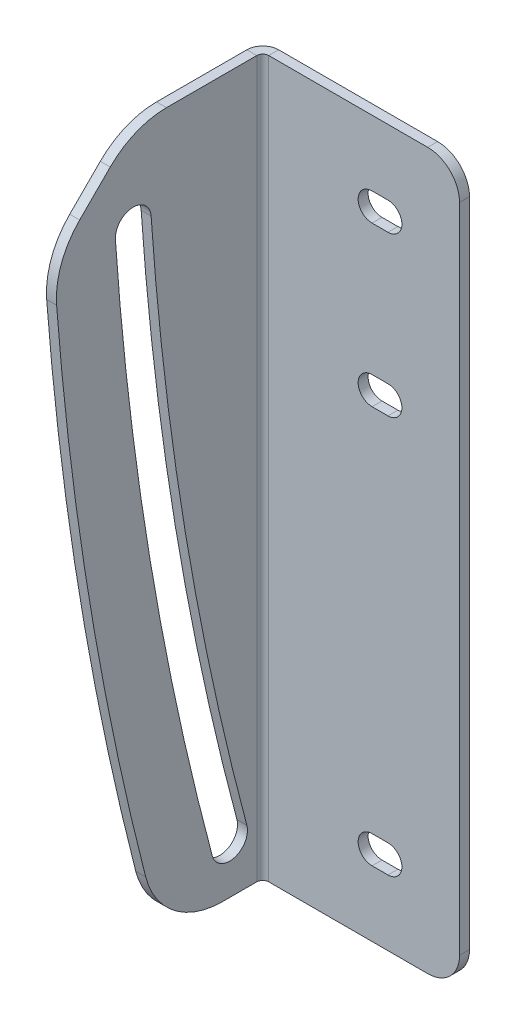
ISO-10303-21;
HEADER;
FILE_DESCRIPTION(('STEP AP214'),'2;1');
FILE_NAME('part.step','',(''),(''),'','','');
FILE_SCHEMA(('AUTOMOTIVE_DESIGN { 1 0 10303 214 1 1 1 1 }'));
ENDSEC;
DATA;
#1=APPLICATION_CONTEXT('core data for automotive mechanical design processes');
#2=APPLICATION_PROTOCOL_DEFINITION('international standard','automotive_design',2000,#1);
#3=PRODUCT_CONTEXT('',#1,'mechanical');
#4=PRODUCT('Part','Part','',(#3));
#5=PRODUCT_RELATED_PRODUCT_CATEGORY('part','',(#4));
#6=PRODUCT_DEFINITION_FORMATION('','',#4);
#7=PRODUCT_DEFINITION_CONTEXT('part definition',#1,'design');
#8=PRODUCT_DEFINITION('design','',#6,#7);
#9=PRODUCT_DEFINITION_SHAPE('','',#8);
#10=(LENGTH_UNIT() NAMED_UNIT(*) SI_UNIT(.MILLI.,.METRE.));
#11=(NAMED_UNIT(*) PLANE_ANGLE_UNIT() SI_UNIT($,.RADIAN.));
#12=(NAMED_UNIT(*) SI_UNIT($,.STERADIAN.) SOLID_ANGLE_UNIT());
#13=UNCERTAINTY_MEASURE_WITH_UNIT(LENGTH_MEASURE(1.E-05),#10,'distance_accuracy_value','');
#14=(GEOMETRIC_REPRESENTATION_CONTEXT(3) GLOBAL_UNCERTAINTY_ASSIGNED_CONTEXT((#13)) GLOBAL_UNIT_ASSIGNED_CONTEXT((#10,
#11,#12)) REPRESENTATION_CONTEXT('',''));
#15=CARTESIAN_POINT('',(0.,0.,0.));
#16=DIRECTION('',(0.,0.,1.));
#17=DIRECTION('',(1.,0.,0.));
#18=AXIS2_PLACEMENT_3D('',#15,#16,#17);
#19=CARTESIAN_POINT('',(-49.5,90.,0.));
#20=DIRECTION('',(-1.,0.,0.));
#21=DIRECTION('',(0.,0.,-1.));
#22=AXIS2_PLACEMENT_3D('',#19,#20,#21);
#23=PLANE('',#22);
#24=CARTESIAN_POINT('',(-49.4999999999999,121.,-733.));
#25=DIRECTION('',(1.,0.,0.));
#26=DIRECTION('',(0.,0.,1.));
#27=AXIS2_PLACEMENT_3D('',#24,#25,#26);
#28=CIRCLE('',#27,765.396096885807);
#29=CARTESIAN_POINT('',(-49.5,68.3097820614557,30.5803337315705));
#30=VERTEX_POINT('',#29);
#31=CARTESIAN_POINT('',(-49.5,-76.420146598865,6.49744478592396));
#32=VERTEX_POINT('',#31);
#33=EDGE_CURVE('E239',#30,#32,#28,.T.);
#34=ORIENTED_EDGE('',*,*,#33,.T.);
#35=CARTESIAN_POINT('',(-49.5,-77.5808406020218,10.8451786129925));
#36=DIRECTION('',(-1.,0.,0.));
#37=DIRECTION('',(0.,0.,1.));
#38=AXIS2_PLACEMENT_3D('',#35,#36,#37);
#39=CIRCLE('',#38,4.4999999999999);
#40=CARTESIAN_POINT('',(-49.5,-78.7415346051785,15.1929124400609));
#41=VERTEX_POINT('',#40);
#42=EDGE_CURVE('E268',#32,#41,#39,.T.);
#43=ORIENTED_EDGE('',*,*,#42,.T.);
#44=CARTESIAN_POINT('',(-49.4999999999999,121.,-733.));
#45=DIRECTION('',(-1.,0.,0.));
#46=DIRECTION('',(0.,0.,1.));
#47=AXIS2_PLACEMENT_3D('',#44,#45,#46);
#48=CIRCLE('',#47,774.396096885807);
#49=CARTESIAN_POINT('',(-49.5,67.6902179385442,39.5589828670251));
#50=VERTEX_POINT('',#49);
#51=EDGE_CURVE('E245',#41,#50,#48,.T.);
#52=ORIENTED_EDGE('',*,*,#51,.T.);
#53=CARTESIAN_POINT('',(-49.5,68.,35.0696582992976));
#54=DIRECTION('',(-1.,0.,0.));
#55=DIRECTION('',(0.,0.,-1.));
#56=AXIS2_PLACEMENT_3D('',#53,#54,#55);
#57=CIRCLE('',#56,4.49999999999997);
#58=EDGE_CURVE('E260',#50,#30,#57,.T.);
#59=ORIENTED_EDGE('',*,*,#58,.T.);
#60=EDGE_LOOP('',(#34,#43,#52,#59));
#61=FACE_BOUND('',#60,.T.);
#62=CARTESIAN_POINT('',(-49.4999999999999,121.,-733.));
#63=DIRECTION('',(-1.,0.,0.));
#64=DIRECTION('',(0.,0.,1.));
#65=AXIS2_PLACEMENT_3D('',#62,#63,#64);
#66=CIRCLE('',#65,789.648656049005);
#67=CARTESIAN_POINT('',(-49.5,-74.9633036710672,31.9466540970822));
#68=VERTEX_POINT('',#67);
#69=CARTESIAN_POINT('',(-49.5,60.7830348010761,54.3492980261251));
#70=VERTEX_POINT('',#69);
#71=EDGE_CURVE('E487',#68,#70,#66,.T.);
#72=ORIENTED_EDGE('',*,*,#71,.F.);
#73=CARTESIAN_POINT('',(-49.5,-70.,12.5722994841211));
#74=DIRECTION('',(1.,0.,0.));
#75=DIRECTION('',(0.,0.,-1.));
#76=AXIS2_PLACEMENT_3D('',#73,#74,#75);
#77=CIRCLE('',#76,20.);
#78=CARTESIAN_POINT('',(-49.5,-90.,12.5722994841211));
#79=VERTEX_POINT('',#78);
#80=EDGE_CURVE('E459',#79,#68,#77,.F.);
#81=ORIENTED_EDGE('',*,*,#80,.F.);
#82=DIRECTION('',(0.,0.,1.));
#83=VECTOR('',#82,1.);
#84=CARTESIAN_POINT('',(-49.5,-90.,0.));
#85=LINE('',#84,#83);
#86=CARTESIAN_POINT('',(-49.5,-90.,4.));
#87=VERTEX_POINT('',#86);
#88=EDGE_CURVE('E372',#87,#79,#85,.T.);
#89=ORIENTED_EDGE('',*,*,#88,.F.);
#90=DIRECTION('',(0.,-1.,0.));
#91=VECTOR('',#90,1.);
#92=CARTESIAN_POINT('',(-49.5,90.,4.));
#93=LINE('',#92,#91);
#94=CARTESIAN_POINT('',(-49.5,90.,4.));
#95=VERTEX_POINT('',#94);
#96=EDGE_CURVE('E388',#95,#87,#93,.T.);
#97=ORIENTED_EDGE('',*,*,#96,.F.);
#98=DIRECTION('',(0.,0.,1.));
#99=VECTOR('',#98,1.);
#100=CARTESIAN_POINT('',(-49.5,90.,0.));
#101=LINE('',#100,#99);
#102=CARTESIAN_POINT('',(-49.5,90.,26.7157287525381));
#103=VERTEX_POINT('',#102);
#104=EDGE_CURVE('E373',#95,#103,#101,.T.);
#105=ORIENTED_EDGE('',*,*,#104,.T.);
#106=CARTESIAN_POINT('',(-49.5,70.,26.7157287525381));
#107=DIRECTION('',(1.,0.,0.));
#108=DIRECTION('',(0.,0.,-1.));
#109=AXIS2_PLACEMENT_3D('',#106,#107,#108);
#110=CIRCLE('',#109,20.);
#111=CARTESIAN_POINT('',(-49.5,84.1421356237309,40.8578643762691));
#112=VERTEX_POINT('',#111);
#113=EDGE_CURVE('E462',#112,#103,#110,.F.);
#114=ORIENTED_EDGE('',*,*,#113,.F.);
#115=DIRECTION('',(0.,-0.707106781186548,0.707106781186547));
#116=VECTOR('',#115,1.);
#117=CARTESIAN_POINT('',(-49.5,70.,55.));
#118=LINE('',#117,#116);
#119=CARTESIAN_POINT('',(-49.5,76.4503288541322,48.5496711458678));
#120=VERTEX_POINT('',#119);
#121=EDGE_CURVE('E429',#120,#112,#118,.F.);
#122=ORIENTED_EDGE('',*,*,#121,.F.);
#123=CARTESIAN_POINT('',(-49.5,62.3081932304013,34.4075355221369));
#124=DIRECTION('',(1.,0.,0.));
#125=DIRECTION('',(0.,0.,-1.));
#126=AXIS2_PLACEMENT_3D('',#123,#124,#125);
#127=CIRCLE('',#126,20.);
#128=EDGE_CURVE('E464',#70,#120,#127,.F.);
#129=ORIENTED_EDGE('',*,*,#128,.F.);
#130=EDGE_LOOP('',(#72,#81,#89,#97,#105,#114,#122,#129));
#131=FACE_BOUND('',#130,.T.);
#132=ADVANCED_FACE('F37',(#61,#131),#23,.F.);
#133=CARTESIAN_POINT('',(-52.,90.,0.));
#134=DIRECTION('',(-1.,0.,0.));
#135=DIRECTION('',(0.,0.,-1.));
#136=AXIS2_PLACEMENT_3D('',#133,#134,#135);
#137=PLANE('',#136);
#138=CARTESIAN_POINT('',(-52.,68.,35.0696582992976));
#139=DIRECTION('',(1.,0.,0.));
#140=DIRECTION('',(0.,0.,-1.));
#141=AXIS2_PLACEMENT_3D('',#138,#139,#140);
#142=CIRCLE('',#141,4.49999999999997);
#143=CARTESIAN_POINT('',(-52.,67.6902179385442,39.558982867025));
#144=VERTEX_POINT('',#143);
#145=CARTESIAN_POINT('',(-52.,68.3097820614557,30.5803337315705));
#146=VERTEX_POINT('',#145);
#147=EDGE_CURVE('E252',#144,#146,#142,.F.);
#148=ORIENTED_EDGE('',*,*,#147,.F.);
#149=CARTESIAN_POINT('',(-51.9999999999999,121.,-733.));
#150=DIRECTION('',(1.,0.,0.));
#151=DIRECTION('',(0.,0.,-1.));
#152=AXIS2_PLACEMENT_3D('',#149,#150,#151);
#153=CIRCLE('',#152,774.396096885807);
#154=CARTESIAN_POINT('',(-52.,-78.7415346051785,15.1929124400609));
#155=VERTEX_POINT('',#154);
#156=EDGE_CURVE('E261',#155,#144,#153,.F.);
#157=ORIENTED_EDGE('',*,*,#156,.F.);
#158=CARTESIAN_POINT('',(-52.,-77.5808406020218,10.8451786129925));
#159=DIRECTION('',(1.,0.,0.));
#160=DIRECTION('',(0.,0.,-1.));
#161=AXIS2_PLACEMENT_3D('',#158,#159,#160);
#162=CIRCLE('',#161,4.4999999999999);
#163=CARTESIAN_POINT('',(-52.,-76.420146598865,6.49744478592396));
#164=VERTEX_POINT('',#163);
#165=EDGE_CURVE('E254',#164,#155,#162,.F.);
#166=ORIENTED_EDGE('',*,*,#165,.F.);
#167=CARTESIAN_POINT('',(-51.9999999999999,121.,-733.));
#168=DIRECTION('',(1.,0.,0.));
#169=DIRECTION('',(0.,0.,-1.));
#170=AXIS2_PLACEMENT_3D('',#167,#168,#169);
#171=CIRCLE('',#170,765.396096885807);
#172=EDGE_CURVE('E236',#146,#164,#171,.T.);
#173=ORIENTED_EDGE('',*,*,#172,.F.);
#174=EDGE_LOOP('',(#148,#157,#166,#173));
#175=FACE_BOUND('',#174,.T.);
#176=DIRECTION('',(0.,0.707106781186548,-0.707106781186547));
#177=VECTOR('',#176,1.);
#178=CARTESIAN_POINT('',(-52.,107.5,17.5));
#179=LINE('',#178,#177);
#180=CARTESIAN_POINT('',(-52.,84.1421356237309,40.8578643762691));
#181=VERTEX_POINT('',#180);
#182=CARTESIAN_POINT('',(-52.,76.4503288541322,48.5496711458678));
#183=VERTEX_POINT('',#182);
#184=EDGE_CURVE('E432',#181,#183,#179,.F.);
#185=ORIENTED_EDGE('',*,*,#184,.F.);
#186=CARTESIAN_POINT('',(-52.,70.,26.7157287525381));
#187=DIRECTION('',(1.,0.,0.));
#188=DIRECTION('',(0.,0.,-1.));
#189=AXIS2_PLACEMENT_3D('',#186,#187,#188);
#190=CIRCLE('',#189,20.);
#191=CARTESIAN_POINT('',(-52.,90.,26.7157287525381));
#192=VERTEX_POINT('',#191);
#193=EDGE_CURVE('E473',#192,#181,#190,.T.);
#194=ORIENTED_EDGE('',*,*,#193,.F.);
#195=DIRECTION('',(0.,0.,1.));
#196=VECTOR('',#195,1.);
#197=CARTESIAN_POINT('',(-52.,90.,0.));
#198=LINE('',#197,#196);
#199=CARTESIAN_POINT('',(-52.,90.,4.));
#200=VERTEX_POINT('',#199);
#201=EDGE_CURVE('E376',#200,#192,#198,.T.);
#202=ORIENTED_EDGE('',*,*,#201,.F.);
#203=DIRECTION('',(0.,-1.,0.));
#204=VECTOR('',#203,1.);
#205=CARTESIAN_POINT('',(-52.,90.,4.));
#206=LINE('',#205,#204);
#207=CARTESIAN_POINT('',(-52.,-90.,4.));
#208=VERTEX_POINT('',#207);
#209=EDGE_CURVE('E414',#200,#208,#206,.T.);
#210=ORIENTED_EDGE('',*,*,#209,.T.);
#211=DIRECTION('',(0.,0.,1.));
#212=VECTOR('',#211,1.);
#213=CARTESIAN_POINT('',(-52.,-90.,0.));
#214=LINE('',#213,#212);
#215=CARTESIAN_POINT('',(-52.,-90.,12.5722994841211));
#216=VERTEX_POINT('',#215);
#217=EDGE_CURVE('E390',#208,#216,#214,.T.);
#218=ORIENTED_EDGE('',*,*,#217,.T.);
#219=CARTESIAN_POINT('',(-52.,-70.,12.5722994841211));
#220=DIRECTION('',(1.,0.,0.));
#221=DIRECTION('',(0.,0.,-1.));
#222=AXIS2_PLACEMENT_3D('',#219,#220,#221);
#223=CIRCLE('',#222,20.);
#224=CARTESIAN_POINT('',(-52.,-74.9633036710672,31.9466540970822));
#225=VERTEX_POINT('',#224);
#226=EDGE_CURVE('E471',#225,#216,#223,.T.);
#227=ORIENTED_EDGE('',*,*,#226,.F.);
#228=CARTESIAN_POINT('',(-51.9999999999999,121.,-733.));
#229=DIRECTION('',(1.,0.,0.));
#230=DIRECTION('',(0.,0.,-1.));
#231=AXIS2_PLACEMENT_3D('',#228,#229,#230);
#232=CIRCLE('',#231,789.648656049005);
#233=CARTESIAN_POINT('',(-52.,60.7830348010761,54.3492980261251));
#234=VERTEX_POINT('',#233);
#235=EDGE_CURVE('E485',#234,#225,#232,.T.);
#236=ORIENTED_EDGE('',*,*,#235,.F.);
#237=CARTESIAN_POINT('',(-52.,62.3081932304013,34.4075355221369));
#238=DIRECTION('',(1.,0.,0.));
#239=DIRECTION('',(0.,0.,-1.));
#240=AXIS2_PLACEMENT_3D('',#237,#238,#239);
#241=CIRCLE('',#240,20.);
#242=EDGE_CURVE('E475',#183,#234,#241,.T.);
#243=ORIENTED_EDGE('',*,*,#242,.F.);
#244=EDGE_LOOP('',(#185,#194,#202,#210,#218,#227,#236,#243));
#245=FACE_BOUND('',#244,.T.);
#246=ADVANCED_FACE('F249',(#175,#245),#137,.T.);
#247=CARTESIAN_POINT('',(-48.,-90.,4.));
#248=DIRECTION('',(0.,1.,0.));
#249=DIRECTION('',(-1.,0.,0.));
#250=AXIS2_PLACEMENT_3D('',#247,#248,#249);
#251=PLANE('',#250);
#252=ORIENTED_EDGE('',*,*,#217,.F.);
#253=DIRECTION('',(-1.,0.,0.));
#254=VECTOR('',#253,1.);
#255=CARTESIAN_POINT('',(-49.5,-90.,4.));
#256=LINE('',#255,#254);
#257=EDGE_CURVE('E417',#87,#208,#256,.T.);
#258=ORIENTED_EDGE('',*,*,#257,.F.);
#259=ORIENTED_EDGE('',*,*,#88,.T.);
#260=DIRECTION('',(-1.,0.,0.));
#261=VECTOR('',#260,1.);
#262=CARTESIAN_POINT('',(-49.5,-90.,12.5722994841211));
#263=LINE('',#262,#261);
#264=EDGE_CURVE('E11',#216,#79,#263,.F.);
#265=ORIENTED_EDGE('',*,*,#264,.F.);
#266=EDGE_LOOP('',(#252,#258,#259,#265));
#267=FACE_BOUND('',#266,.T.);
#268=ADVANCED_FACE('F516',(#267),#251,.F.);
#269=CARTESIAN_POINT('',(-52.,90.,4.));
#270=DIRECTION('',(0.,1.,0.));
#271=DIRECTION('',(0.,0.,1.));
#272=AXIS2_PLACEMENT_3D('',#269,#270,#271);
#273=PLANE('',#272);
#274=DIRECTION('',(1.,0.,0.));
#275=VECTOR('',#274,1.);
#276=CARTESIAN_POINT('',(-52.,90.,4.));
#277=LINE('',#276,#275);
#278=EDGE_CURVE('E426',#200,#95,#277,.T.);
#279=ORIENTED_EDGE('',*,*,#278,.T.);
#280=CARTESIAN_POINT('',(-48.,90.,4.));
#281=DIRECTION('',(0.,-1.,0.));
#282=DIRECTION('',(-1.,0.,0.));
#283=AXIS2_PLACEMENT_3D('',#280,#281,#282);
#284=CIRCLE('',#283,1.5);
#285=CARTESIAN_POINT('',(-48.,90.,2.5));
#286=VERTEX_POINT('',#285);
#287=EDGE_CURVE('E386',#286,#95,#284,.F.);
#288=ORIENTED_EDGE('',*,*,#287,.F.);
#289=DIRECTION('',(0.,0.,-1.));
#290=VECTOR('',#289,1.);
#291=CARTESIAN_POINT('',(-48.,90.,2.5));
#292=LINE('',#291,#290);
#293=CARTESIAN_POINT('',(-48.,90.,0.));
#294=VERTEX_POINT('',#293);
#295=EDGE_CURVE('E423',#286,#294,#292,.T.);
#296=ORIENTED_EDGE('',*,*,#295,.T.);
#297=CARTESIAN_POINT('',(-48.,90.,4.));
#298=DIRECTION('',(0.,-1.,0.));
#299=DIRECTION('',(0.,0.,1.));
#300=AXIS2_PLACEMENT_3D('',#297,#298,#299);
#301=CIRCLE('',#300,4.);
#302=EDGE_CURVE('E379',#294,#200,#301,.F.);
#303=ORIENTED_EDGE('',*,*,#302,.T.);
#304=EDGE_LOOP('',(#279,#288,#296,#303));
#305=FACE_BOUND('',#304,.T.);
#306=ADVANCED_FACE('F521',(#305),#273,.T.);
#307=CARTESIAN_POINT('',(-48.,90.,2.5));
#308=DIRECTION('',(0.,1.,0.));
#309=DIRECTION('',(0.,0.,1.));
#310=AXIS2_PLACEMENT_3D('',#307,#308,#309);
#311=PLANE('',#310);
#312=ORIENTED_EDGE('',*,*,#104,.F.);
#313=ORIENTED_EDGE('',*,*,#278,.F.);
#314=ORIENTED_EDGE('',*,*,#201,.T.);
#315=DIRECTION('',(1.,0.,0.));
#316=VECTOR('',#315,1.);
#317=CARTESIAN_POINT('',(-48.,90.,26.7157287525381));
#318=LINE('',#317,#316);
#319=EDGE_CURVE('E45',#103,#192,#318,.F.);
#320=ORIENTED_EDGE('',*,*,#319,.F.);
#321=EDGE_LOOP('',(#312,#313,#314,#320));
#322=FACE_BOUND('',#321,.T.);
#323=ADVANCED_FACE('F507',(#322),#311,.T.);
#324=CARTESIAN_POINT('',(-48.,-90.,0.));
#325=DIRECTION('',(0.,-1.,0.));
#326=DIRECTION('',(0.,0.,-1.));
#327=AXIS2_PLACEMENT_3D('',#324,#325,#326);
#328=PLANE('',#327);
#329=DIRECTION('',(0.,0.,1.));
#330=VECTOR('',#329,1.);
#331=CARTESIAN_POINT('',(-48.,-90.,0.));
#332=LINE('',#331,#330);
#333=CARTESIAN_POINT('',(-48.,-90.,0.));
#334=VERTEX_POINT('',#333);
#335=CARTESIAN_POINT('',(-48.,-90.,2.5));
#336=VERTEX_POINT('',#335);
#337=EDGE_CURVE('E420',#334,#336,#332,.T.);
#338=ORIENTED_EDGE('',*,*,#337,.T.);
#339=CARTESIAN_POINT('',(-48.,-90.,4.));
#340=DIRECTION('',(0.,-1.,0.));
#341=DIRECTION('',(-1.,0.,0.));
#342=AXIS2_PLACEMENT_3D('',#339,#340,#341);
#343=CIRCLE('',#342,1.5);
#344=EDGE_CURVE('E377',#336,#87,#343,.F.);
#345=ORIENTED_EDGE('',*,*,#344,.T.);
#346=ORIENTED_EDGE('',*,*,#257,.T.);
#347=CARTESIAN_POINT('',(-48.,-90.,4.));
#348=DIRECTION('',(0.,-1.,0.));
#349=DIRECTION('',(0.,0.,1.));
#350=AXIS2_PLACEMENT_3D('',#347,#348,#349);
#351=CIRCLE('',#350,4.);
#352=EDGE_CURVE('E393',#334,#208,#351,.F.);
#353=ORIENTED_EDGE('',*,*,#352,.F.);
#354=EDGE_LOOP('',(#338,#345,#346,#353));
#355=FACE_BOUND('',#354,.T.);
#356=ADVANCED_FACE('F535',(#355),#328,.T.);
#357=CARTESIAN_POINT('',(-49.5,-90.,4.));
#358=DIRECTION('',(0.,-1.,0.));
#359=DIRECTION('',(0.,0.,-1.));
#360=AXIS2_PLACEMENT_3D('',#357,#358,#359);
#361=PLANE('',#360);
#362=DIRECTION('',(-1.,0.,0.));
#363=VECTOR('',#362,1.);
#364=CARTESIAN_POINT('',(0.,-90.,2.5));
#365=LINE('',#364,#363);
#366=CARTESIAN_POINT('',(-8.,-90.,2.5));
#367=VERTEX_POINT('',#366);
#368=EDGE_CURVE('E398',#367,#336,#365,.T.);
#369=ORIENTED_EDGE('',*,*,#368,.T.);
#370=ORIENTED_EDGE('',*,*,#337,.F.);
#371=DIRECTION('',(-1.,0.,0.));
#372=VECTOR('',#371,1.);
#373=CARTESIAN_POINT('',(0.,-90.,0.));
#374=LINE('',#373,#372);
#375=CARTESIAN_POINT('',(-8.,-90.,0.));
#376=VERTEX_POINT('',#375);
#377=EDGE_CURVE('E395',#376,#334,#374,.T.);
#378=ORIENTED_EDGE('',*,*,#377,.F.);
#379=DIRECTION('',(0.,0.,-1.));
#380=VECTOR('',#379,1.);
#381=CARTESIAN_POINT('',(-8.,-90.,4.));
#382=LINE('',#381,#380);
#383=EDGE_CURVE('E452',#367,#376,#382,.T.);
#384=ORIENTED_EDGE('',*,*,#383,.F.);
#385=EDGE_LOOP('',(#369,#370,#378,#384));
#386=FACE_BOUND('',#385,.T.);
#387=ADVANCED_FACE('F536',(#386),#361,.T.);
#388=CARTESIAN_POINT('',(-48.,90.,4.));
#389=DIRECTION('',(0.,-1.,0.));
#390=DIRECTION('',(0.,0.,-1.));
#391=AXIS2_PLACEMENT_3D('',#388,#389,#390);
#392=CYLINDRICAL_SURFACE('',#391,4.);
#393=ORIENTED_EDGE('',*,*,#352,.T.);
#394=ORIENTED_EDGE('',*,*,#209,.F.);
#395=ORIENTED_EDGE('',*,*,#302,.F.);
#396=DIRECTION('',(0.,-1.,0.));
#397=VECTOR('',#396,1.);
#398=CARTESIAN_POINT('',(-48.,90.,0.));
#399=LINE('',#398,#397);
#400=EDGE_CURVE('E412',#294,#334,#399,.T.);
#401=ORIENTED_EDGE('',*,*,#400,.T.);
#402=EDGE_LOOP('',(#393,#394,#395,#401));
#403=FACE_BOUND('',#402,.T.);
#404=ADVANCED_FACE('F513',(#403),#392,.T.);
#405=CARTESIAN_POINT('',(0.,90.,0.));
#406=DIRECTION('',(0.,0.,-1.));
#407=DIRECTION('',(1.,0.,0.));
#408=AXIS2_PLACEMENT_3D('',#405,#406,#407);
#409=PLANE('',#408);
#410=CARTESIAN_POINT('',(-18.,-70.,0.));
#411=DIRECTION('',(0.,0.,1.));
#412=DIRECTION('',(1.,0.,0.));
#413=AXIS2_PLACEMENT_3D('',#410,#411,#412);
#414=CIRCLE('',#413,3.50000000000001);
#415=CARTESIAN_POINT('',(-18.,-66.5,0.));
#416=VERTEX_POINT('',#415);
#417=CARTESIAN_POINT('',(-18.,-73.5,0.));
#418=VERTEX_POINT('',#417);
#419=EDGE_CURVE('E282',#416,#418,#414,.F.);
#420=ORIENTED_EDGE('',*,*,#419,.F.);
#421=DIRECTION('',(1.,0.,0.));
#422=VECTOR('',#421,1.);
#423=CARTESIAN_POINT('',(-18.,-66.5,0.));
#424=LINE('',#423,#422);
#425=CARTESIAN_POINT('',(-22.,-66.5,0.));
#426=VERTEX_POINT('',#425);
#427=EDGE_CURVE('E279',#426,#416,#424,.T.);
#428=ORIENTED_EDGE('',*,*,#427,.F.);
#429=CARTESIAN_POINT('',(-22.,-70.,0.));
#430=DIRECTION('',(0.,0.,1.));
#431=DIRECTION('',(1.,0.,0.));
#432=AXIS2_PLACEMENT_3D('',#429,#430,#431);
#433=CIRCLE('',#432,3.50000000000002);
#434=CARTESIAN_POINT('',(-22.,-73.5000000000001,0.));
#435=VERTEX_POINT('',#434);
#436=EDGE_CURVE('E255',#435,#426,#433,.F.);
#437=ORIENTED_EDGE('',*,*,#436,.F.);
#438=DIRECTION('',(-1.,0.,0.));
#439=VECTOR('',#438,1.);
#440=CARTESIAN_POINT('',(-18.,-73.5,0.));
#441=LINE('',#440,#439);
#442=EDGE_CURVE('E300',#418,#435,#441,.T.);
#443=ORIENTED_EDGE('',*,*,#442,.F.);
#444=EDGE_LOOP('',(#420,#428,#437,#443));
#445=FACE_BOUND('',#444,.T.);
#446=CARTESIAN_POINT('',(-18.,30.,0.));
#447=DIRECTION('',(0.,0.,1.));
#448=DIRECTION('',(1.,0.,0.));
#449=AXIS2_PLACEMENT_3D('',#446,#447,#448);
#450=CIRCLE('',#449,3.5);
#451=CARTESIAN_POINT('',(-18.,33.5,0.));
#452=VERTEX_POINT('',#451);
#453=CARTESIAN_POINT('',(-18.,26.5,0.));
#454=VERTEX_POINT('',#453);
#455=EDGE_CURVE('E314',#452,#454,#450,.F.);
#456=ORIENTED_EDGE('',*,*,#455,.F.);
#457=DIRECTION('',(1.,0.,0.));
#458=VECTOR('',#457,1.);
#459=CARTESIAN_POINT('',(-18.,33.5,0.));
#460=LINE('',#459,#458);
#461=CARTESIAN_POINT('',(-22.,33.5,0.));
#462=VERTEX_POINT('',#461);
#463=EDGE_CURVE('E311',#462,#452,#460,.T.);
#464=ORIENTED_EDGE('',*,*,#463,.F.);
#465=CARTESIAN_POINT('',(-22.,30.,0.));
#466=DIRECTION('',(0.,0.,1.));
#467=DIRECTION('',(1.,0.,0.));
#468=AXIS2_PLACEMENT_3D('',#465,#466,#467);
#469=CIRCLE('',#468,3.5);
#470=CARTESIAN_POINT('',(-22.,26.5,0.));
#471=VERTEX_POINT('',#470);
#472=EDGE_CURVE('E308',#471,#462,#469,.F.);
#473=ORIENTED_EDGE('',*,*,#472,.F.);
#474=DIRECTION('',(-1.,0.,0.));
#475=VECTOR('',#474,1.);
#476=CARTESIAN_POINT('',(-18.,26.5,0.));
#477=LINE('',#476,#475);
#478=EDGE_CURVE('E332',#454,#471,#477,.T.);
#479=ORIENTED_EDGE('',*,*,#478,.F.);
#480=EDGE_LOOP('',(#456,#464,#473,#479));
#481=FACE_BOUND('',#480,.T.);
#482=CARTESIAN_POINT('',(-18.,70.,0.));
#483=DIRECTION('',(0.,0.,1.));
#484=DIRECTION('',(1.,0.,0.));
#485=AXIS2_PLACEMENT_3D('',#482,#483,#484);
#486=CIRCLE('',#485,3.5);
#487=CARTESIAN_POINT('',(-18.,73.5,0.));
#488=VERTEX_POINT('',#487);
#489=CARTESIAN_POINT('',(-18.,66.5,0.));
#490=VERTEX_POINT('',#489);
#491=EDGE_CURVE('E346',#488,#490,#486,.F.);
#492=ORIENTED_EDGE('',*,*,#491,.F.);
#493=DIRECTION('',(1.,0.,0.));
#494=VECTOR('',#493,1.);
#495=CARTESIAN_POINT('',(-18.,73.5,0.));
#496=LINE('',#495,#494);
#497=CARTESIAN_POINT('',(-22.,73.5,0.));
#498=VERTEX_POINT('',#497);
#499=EDGE_CURVE('E343',#498,#488,#496,.T.);
#500=ORIENTED_EDGE('',*,*,#499,.F.);
#501=CARTESIAN_POINT('',(-22.,70.,0.));
#502=DIRECTION('',(0.,0.,1.));
#503=DIRECTION('',(1.,0.,0.));
#504=AXIS2_PLACEMENT_3D('',#501,#502,#503);
#505=CIRCLE('',#504,3.5);
#506=CARTESIAN_POINT('',(-22.,66.5,0.));
#507=VERTEX_POINT('',#506);
#508=EDGE_CURVE('E340',#507,#498,#505,.F.);
#509=ORIENTED_EDGE('',*,*,#508,.F.);
#510=DIRECTION('',(-1.,0.,0.));
#511=VECTOR('',#510,1.);
#512=CARTESIAN_POINT('',(-18.,66.5,0.));
#513=LINE('',#512,#511);
#514=EDGE_CURVE('E364',#490,#507,#513,.T.);
#515=ORIENTED_EDGE('',*,*,#514,.F.);
#516=EDGE_LOOP('',(#492,#500,#509,#515));
#517=FACE_BOUND('',#516,.T.);
#518=DIRECTION('',(0.,-1.,0.));
#519=VECTOR('',#518,1.);
#520=CARTESIAN_POINT('',(0.,90.,0.));
#521=LINE('',#520,#519);
#522=CARTESIAN_POINT('',(0.,82.,0.));
#523=VERTEX_POINT('',#522);
#524=CARTESIAN_POINT('',(0.,-81.9999999999999,0.));
#525=VERTEX_POINT('',#524);
#526=EDGE_CURVE('E409',#523,#525,#521,.T.);
#527=ORIENTED_EDGE('',*,*,#526,.T.);
#528=CARTESIAN_POINT('',(-8.,-82.,0.));
#529=DIRECTION('',(0.,0.,1.));
#530=DIRECTION('',(1.,0.,0.));
#531=AXIS2_PLACEMENT_3D('',#528,#529,#530);
#532=CIRCLE('',#531,8.);
#533=EDGE_CURVE('E440',#376,#525,#532,.T.);
#534=ORIENTED_EDGE('',*,*,#533,.F.);
#535=ORIENTED_EDGE('',*,*,#377,.T.);
#536=ORIENTED_EDGE('',*,*,#400,.F.);
#537=DIRECTION('',(-1.,0.,0.));
#538=VECTOR('',#537,1.);
#539=CARTESIAN_POINT('',(0.,90.,0.));
#540=LINE('',#539,#538);
#541=CARTESIAN_POINT('',(-7.99999999999999,90.,0.));
#542=VERTEX_POINT('',#541);
#543=EDGE_CURVE('E381',#542,#294,#540,.T.);
#544=ORIENTED_EDGE('',*,*,#543,.F.);
#545=CARTESIAN_POINT('',(-8.,82.,0.));
#546=DIRECTION('',(0.,0.,1.));
#547=DIRECTION('',(1.,0.,0.));
#548=AXIS2_PLACEMENT_3D('',#545,#546,#547);
#549=CIRCLE('',#548,8.);
#550=EDGE_CURVE('E443',#523,#542,#549,.T.);
#551=ORIENTED_EDGE('',*,*,#550,.F.);
#552=EDGE_LOOP('',(#527,#534,#535,#536,#544,#551));
#553=FACE_BOUND('',#552,.T.);
#554=ADVANCED_FACE('F530',(#445,#481,#517,#553),#409,.T.);
#555=CARTESIAN_POINT('',(0.,90.,2.5));
#556=DIRECTION('',(1.,0.,0.));
#557=DIRECTION('',(0.,0.,1.));
#558=AXIS2_PLACEMENT_3D('',#555,#556,#557);
#559=PLANE('',#558);
#560=DIRECTION('',(0.,-1.,0.));
#561=VECTOR('',#560,1.);
#562=CARTESIAN_POINT('',(0.,90.,2.5));
#563=LINE('',#562,#561);
#564=CARTESIAN_POINT('',(0.,82.,2.5));
#565=VERTEX_POINT('',#564);
#566=CARTESIAN_POINT('',(0.,-81.9999999999999,2.5));
#567=VERTEX_POINT('',#566);
#568=EDGE_CURVE('E406',#565,#567,#563,.T.);
#569=ORIENTED_EDGE('',*,*,#568,.T.);
#570=DIRECTION('',(0.,0.,-1.));
#571=VECTOR('',#570,1.);
#572=CARTESIAN_POINT('',(0.,-82.,2.5));
#573=LINE('',#572,#571);
#574=EDGE_CURVE('E435',#525,#567,#573,.F.);
#575=ORIENTED_EDGE('',*,*,#574,.F.);
#576=ORIENTED_EDGE('',*,*,#526,.F.);
#577=DIRECTION('',(0.,0.,-1.));
#578=VECTOR('',#577,1.);
#579=CARTESIAN_POINT('',(0.,82.,2.5));
#580=LINE('',#579,#578);
#581=EDGE_CURVE('E438',#565,#523,#580,.T.);
#582=ORIENTED_EDGE('',*,*,#581,.F.);
#583=EDGE_LOOP('',(#569,#575,#576,#582));
#584=FACE_BOUND('',#583,.T.);
#585=ADVANCED_FACE('F547',(#584),#559,.T.);
#586=CARTESIAN_POINT('',(0.,90.,2.5));
#587=DIRECTION('',(0.,0.,-1.));
#588=DIRECTION('',(1.,0.,0.));
#589=AXIS2_PLACEMENT_3D('',#586,#587,#588);
#590=PLANE('',#589);
#591=DIRECTION('',(-1.,0.,0.));
#592=VECTOR('',#591,1.);
#593=CARTESIAN_POINT('',(-18.,-73.5,2.5));
#594=LINE('',#593,#592);
#595=CARTESIAN_POINT('',(-18.,-73.5000000000001,2.5));
#596=VERTEX_POINT('',#595);
#597=CARTESIAN_POINT('',(-22.,-73.5,2.5));
#598=VERTEX_POINT('',#597);
#599=EDGE_CURVE('E288',#596,#598,#594,.T.);
#600=ORIENTED_EDGE('',*,*,#599,.T.);
#601=CARTESIAN_POINT('',(-22.,-70.,2.5));
#602=DIRECTION('',(0.,0.,-1.));
#603=DIRECTION('',(-1.,0.,0.));
#604=AXIS2_PLACEMENT_3D('',#601,#602,#603);
#605=CIRCLE('',#604,3.50000000000002);
#606=CARTESIAN_POINT('',(-22.,-66.5,2.5));
#607=VERTEX_POINT('',#606);
#608=EDGE_CURVE('E291',#598,#607,#605,.T.);
#609=ORIENTED_EDGE('',*,*,#608,.T.);
#610=DIRECTION('',(1.,0.,0.));
#611=VECTOR('',#610,1.);
#612=CARTESIAN_POINT('',(-18.,-66.5,2.5));
#613=LINE('',#612,#611);
#614=CARTESIAN_POINT('',(-18.,-66.5,2.5));
#615=VERTEX_POINT('',#614);
#616=EDGE_CURVE('E294',#607,#615,#613,.T.);
#617=ORIENTED_EDGE('',*,*,#616,.T.);
#618=CARTESIAN_POINT('',(-18.,-70.,2.5));
#619=DIRECTION('',(0.,0.,-1.));
#620=DIRECTION('',(-1.,0.,0.));
#621=AXIS2_PLACEMENT_3D('',#618,#619,#620);
#622=CIRCLE('',#621,3.50000000000001);
#623=EDGE_CURVE('E285',#615,#596,#622,.T.);
#624=ORIENTED_EDGE('',*,*,#623,.T.);
#625=EDGE_LOOP('',(#600,#609,#617,#624));
#626=FACE_BOUND('',#625,.T.);
#627=DIRECTION('',(-1.,0.,0.));
#628=VECTOR('',#627,1.);
#629=CARTESIAN_POINT('',(-18.,26.5,2.5));
#630=LINE('',#629,#628);
#631=CARTESIAN_POINT('',(-18.,26.5,2.5));
#632=VERTEX_POINT('',#631);
#633=CARTESIAN_POINT('',(-22.,26.5,2.5));
#634=VERTEX_POINT('',#633);
#635=EDGE_CURVE('E320',#632,#634,#630,.T.);
#636=ORIENTED_EDGE('',*,*,#635,.T.);
#637=CARTESIAN_POINT('',(-22.,30.,2.5));
#638=DIRECTION('',(0.,0.,-1.));
#639=DIRECTION('',(-1.,0.,0.));
#640=AXIS2_PLACEMENT_3D('',#637,#638,#639);
#641=CIRCLE('',#640,3.5);
#642=CARTESIAN_POINT('',(-22.,33.5,2.5));
#643=VERTEX_POINT('',#642);
#644=EDGE_CURVE('E323',#634,#643,#641,.T.);
#645=ORIENTED_EDGE('',*,*,#644,.T.);
#646=DIRECTION('',(1.,0.,0.));
#647=VECTOR('',#646,1.);
#648=CARTESIAN_POINT('',(-18.,33.5,2.5));
#649=LINE('',#648,#647);
#650=CARTESIAN_POINT('',(-18.,33.5,2.5));
#651=VERTEX_POINT('',#650);
#652=EDGE_CURVE('E326',#643,#651,#649,.T.);
#653=ORIENTED_EDGE('',*,*,#652,.T.);
#654=CARTESIAN_POINT('',(-18.,30.,2.5));
#655=DIRECTION('',(0.,0.,-1.));
#656=DIRECTION('',(-1.,0.,0.));
#657=AXIS2_PLACEMENT_3D('',#654,#655,#656);
#658=CIRCLE('',#657,3.5);
#659=EDGE_CURVE('E317',#651,#632,#658,.T.);
#660=ORIENTED_EDGE('',*,*,#659,.T.);
#661=EDGE_LOOP('',(#636,#645,#653,#660));
#662=FACE_BOUND('',#661,.T.);
#663=DIRECTION('',(-1.,0.,0.));
#664=VECTOR('',#663,1.);
#665=CARTESIAN_POINT('',(-18.,66.5,2.5));
#666=LINE('',#665,#664);
#667=CARTESIAN_POINT('',(-18.,66.5,2.5));
#668=VERTEX_POINT('',#667);
#669=CARTESIAN_POINT('',(-22.,66.5,2.5));
#670=VERTEX_POINT('',#669);
#671=EDGE_CURVE('E352',#668,#670,#666,.T.);
#672=ORIENTED_EDGE('',*,*,#671,.T.);
#673=CARTESIAN_POINT('',(-22.,70.,2.5));
#674=DIRECTION('',(0.,0.,-1.));
#675=DIRECTION('',(-1.,0.,0.));
#676=AXIS2_PLACEMENT_3D('',#673,#674,#675);
#677=CIRCLE('',#676,3.5);
#678=CARTESIAN_POINT('',(-22.,73.5,2.5));
#679=VERTEX_POINT('',#678);
#680=EDGE_CURVE('E355',#670,#679,#677,.T.);
#681=ORIENTED_EDGE('',*,*,#680,.T.);
#682=DIRECTION('',(1.,0.,0.));
#683=VECTOR('',#682,1.);
#684=CARTESIAN_POINT('',(-18.,73.5,2.5));
#685=LINE('',#684,#683);
#686=CARTESIAN_POINT('',(-18.,73.5,2.5));
#687=VERTEX_POINT('',#686);
#688=EDGE_CURVE('E358',#679,#687,#685,.T.);
#689=ORIENTED_EDGE('',*,*,#688,.T.);
#690=CARTESIAN_POINT('',(-18.,70.,2.5));
#691=DIRECTION('',(0.,0.,-1.));
#692=DIRECTION('',(-1.,0.,0.));
#693=AXIS2_PLACEMENT_3D('',#690,#691,#692);
#694=CIRCLE('',#693,3.5);
#695=EDGE_CURVE('E349',#687,#668,#694,.T.);
#696=ORIENTED_EDGE('',*,*,#695,.T.);
#697=EDGE_LOOP('',(#672,#681,#689,#696));
#698=FACE_BOUND('',#697,.T.);
#699=DIRECTION('',(-1.,0.,0.));
#700=VECTOR('',#699,1.);
#701=CARTESIAN_POINT('',(0.,90.,2.5));
#702=LINE('',#701,#700);
#703=CARTESIAN_POINT('',(-8.,90.,2.5));
#704=VERTEX_POINT('',#703);
#705=EDGE_CURVE('E383',#704,#286,#702,.T.);
#706=ORIENTED_EDGE('',*,*,#705,.T.);
#707=DIRECTION('',(0.,-1.,0.));
#708=VECTOR('',#707,1.);
#709=CARTESIAN_POINT('',(-48.,90.,2.5));
#710=LINE('',#709,#708);
#711=EDGE_CURVE('E404',#286,#336,#710,.T.);
#712=ORIENTED_EDGE('',*,*,#711,.T.);
#713=ORIENTED_EDGE('',*,*,#368,.F.);
#714=CARTESIAN_POINT('',(-8.,-82.,2.5));
#715=DIRECTION('',(0.,0.,1.));
#716=DIRECTION('',(1.,0.,0.));
#717=AXIS2_PLACEMENT_3D('',#714,#715,#716);
#718=CIRCLE('',#717,8.);
#719=EDGE_CURVE('E448',#567,#367,#718,.F.);
#720=ORIENTED_EDGE('',*,*,#719,.F.);
#721=ORIENTED_EDGE('',*,*,#568,.F.);
#722=CARTESIAN_POINT('',(-8.,82.,2.5));
#723=DIRECTION('',(0.,0.,1.));
#724=DIRECTION('',(1.,0.,0.));
#725=AXIS2_PLACEMENT_3D('',#722,#723,#724);
#726=CIRCLE('',#725,8.);
#727=EDGE_CURVE('E450',#704,#565,#726,.F.);
#728=ORIENTED_EDGE('',*,*,#727,.F.);
#729=EDGE_LOOP('',(#706,#712,#713,#720,#721,#728));
#730=FACE_BOUND('',#729,.T.);
#731=ADVANCED_FACE('F539',(#626,#662,#698,#730),#590,.F.);
#732=CARTESIAN_POINT('',(-48.,90.,4.));
#733=DIRECTION('',(0.,-1.,0.));
#734=DIRECTION('',(0.,0.,-1.));
#735=AXIS2_PLACEMENT_3D('',#732,#733,#734);
#736=CYLINDRICAL_SURFACE('',#735,1.5);
#737=ORIENTED_EDGE('',*,*,#344,.F.);
#738=ORIENTED_EDGE('',*,*,#711,.F.);
#739=ORIENTED_EDGE('',*,*,#287,.T.);
#740=ORIENTED_EDGE('',*,*,#96,.T.);
#741=EDGE_LOOP('',(#737,#738,#739,#740));
#742=FACE_BOUND('',#741,.T.);
#743=ADVANCED_FACE('F520',(#742),#736,.F.);
#744=CARTESIAN_POINT('',(-48.,90.,4.));
#745=DIRECTION('',(0.,1.,0.));
#746=DIRECTION('',(-1.,0.,0.));
#747=AXIS2_PLACEMENT_3D('',#744,#745,#746);
#748=PLANE('',#747);
#749=ORIENTED_EDGE('',*,*,#543,.T.);
#750=ORIENTED_EDGE('',*,*,#295,.F.);
#751=ORIENTED_EDGE('',*,*,#705,.F.);
#752=DIRECTION('',(0.,0.,-1.));
#753=VECTOR('',#752,1.);
#754=CARTESIAN_POINT('',(-8.,90.,4.));
#755=LINE('',#754,#753);
#756=EDGE_CURVE('E446',#542,#704,#755,.F.);
#757=ORIENTED_EDGE('',*,*,#756,.F.);
#758=EDGE_LOOP('',(#749,#750,#751,#757));
#759=FACE_BOUND('',#758,.T.);
#760=ADVANCED_FACE('F525',(#759),#748,.T.);
#761=CARTESIAN_POINT('',(-18.,70.,-0.00100000000000013));
#762=DIRECTION('',(0.,0.,1.));
#763=DIRECTION('',(-1.,0.,0.));
#764=AXIS2_PLACEMENT_3D('',#761,#762,#763);
#765=CYLINDRICAL_SURFACE('',#764,3.5);
#766=DIRECTION('',(0.,0.,1.));
#767=VECTOR('',#766,1.);
#768=CARTESIAN_POINT('',(-18.,73.5,-0.00100000000000013));
#769=LINE('',#768,#767);
#770=EDGE_CURVE('E362',#488,#687,#769,.T.);
#771=ORIENTED_EDGE('',*,*,#770,.F.);
#772=ORIENTED_EDGE('',*,*,#491,.T.);
#773=DIRECTION('',(0.,0.,1.));
#774=VECTOR('',#773,1.);
#775=CARTESIAN_POINT('',(-18.,66.5,-0.00100000000000013));
#776=LINE('',#775,#774);
#777=EDGE_CURVE('E361',#490,#668,#776,.T.);
#778=ORIENTED_EDGE('',*,*,#777,.T.);
#779=ORIENTED_EDGE('',*,*,#695,.F.);
#780=EDGE_LOOP('',(#771,#772,#778,#779));
#781=FACE_BOUND('',#780,.T.);
#782=ADVANCED_FACE('F630',(#781),#765,.F.);
#783=CARTESIAN_POINT('',(-18.,73.5,-0.00100000000000013));
#784=DIRECTION('',(0.,1.,0.));
#785=DIRECTION('',(0.,0.,1.));
#786=AXIS2_PLACEMENT_3D('',#783,#784,#785);
#787=PLANE('',#786);
#788=DIRECTION('',(0.,0.,1.));
#789=VECTOR('',#788,1.);
#790=CARTESIAN_POINT('',(-22.,73.5,-0.00100000000000013));
#791=LINE('',#790,#789);
#792=EDGE_CURVE('E365',#498,#679,#791,.T.);
#793=ORIENTED_EDGE('',*,*,#792,.F.);
#794=ORIENTED_EDGE('',*,*,#499,.T.);
#795=ORIENTED_EDGE('',*,*,#770,.T.);
#796=ORIENTED_EDGE('',*,*,#688,.F.);
#797=EDGE_LOOP('',(#793,#794,#795,#796));
#798=FACE_BOUND('',#797,.T.);
#799=ADVANCED_FACE('F626',(#798),#787,.F.);
#800=CARTESIAN_POINT('',(-22.,70.,-0.00100000000000013));
#801=DIRECTION('',(0.,0.,1.));
#802=DIRECTION('',(-1.,0.,0.));
#803=AXIS2_PLACEMENT_3D('',#800,#801,#802);
#804=CYLINDRICAL_SURFACE('',#803,3.5);
#805=DIRECTION('',(0.,0.,1.));
#806=VECTOR('',#805,1.);
#807=CARTESIAN_POINT('',(-22.,66.5,-0.00100000000000013));
#808=LINE('',#807,#806);
#809=EDGE_CURVE('E367',#507,#670,#808,.T.);
#810=ORIENTED_EDGE('',*,*,#809,.F.);
#811=ORIENTED_EDGE('',*,*,#508,.T.);
#812=ORIENTED_EDGE('',*,*,#792,.T.);
#813=ORIENTED_EDGE('',*,*,#680,.F.);
#814=EDGE_LOOP('',(#810,#811,#812,#813));
#815=FACE_BOUND('',#814,.T.);
#816=ADVANCED_FACE('F629',(#815),#804,.F.);
#817=CARTESIAN_POINT('',(-18.,66.5,-0.00100000000000013));
#818=DIRECTION('',(0.,-1.,0.));
#819=DIRECTION('',(0.,0.,-1.));
#820=AXIS2_PLACEMENT_3D('',#817,#818,#819);
#821=PLANE('',#820);
#822=ORIENTED_EDGE('',*,*,#777,.F.);
#823=ORIENTED_EDGE('',*,*,#514,.T.);
#824=ORIENTED_EDGE('',*,*,#809,.T.);
#825=ORIENTED_EDGE('',*,*,#671,.F.);
#826=EDGE_LOOP('',(#822,#823,#824,#825));
#827=FACE_BOUND('',#826,.T.);
#828=ADVANCED_FACE('F624',(#827),#821,.F.);
#829=CARTESIAN_POINT('',(-18.,30.,-0.00100000000000013));
#830=DIRECTION('',(0.,0.,1.));
#831=DIRECTION('',(-1.,0.,0.));
#832=AXIS2_PLACEMENT_3D('',#829,#830,#831);
#833=CYLINDRICAL_SURFACE('',#832,3.5);
#834=DIRECTION('',(0.,0.,1.));
#835=VECTOR('',#834,1.);
#836=CARTESIAN_POINT('',(-18.,33.5,-0.00100000000000013));
#837=LINE('',#836,#835);
#838=EDGE_CURVE('E330',#452,#651,#837,.T.);
#839=ORIENTED_EDGE('',*,*,#838,.F.);
#840=ORIENTED_EDGE('',*,*,#455,.T.);
#841=DIRECTION('',(0.,0.,1.));
#842=VECTOR('',#841,1.);
#843=CARTESIAN_POINT('',(-18.,26.5,-0.00100000000000013));
#844=LINE('',#843,#842);
#845=EDGE_CURVE('E329',#454,#632,#844,.T.);
#846=ORIENTED_EDGE('',*,*,#845,.T.);
#847=ORIENTED_EDGE('',*,*,#659,.F.);
#848=EDGE_LOOP('',(#839,#840,#846,#847));
#849=FACE_BOUND('',#848,.T.);
#850=ADVANCED_FACE('F614',(#849),#833,.F.);
#851=CARTESIAN_POINT('',(-18.,33.5,-0.00100000000000013));
#852=DIRECTION('',(0.,1.,0.));
#853=DIRECTION('',(0.,0.,1.));
#854=AXIS2_PLACEMENT_3D('',#851,#852,#853);
#855=PLANE('',#854);
#856=DIRECTION('',(0.,0.,1.));
#857=VECTOR('',#856,1.);
#858=CARTESIAN_POINT('',(-22.,33.5,-0.00100000000000013));
#859=LINE('',#858,#857);
#860=EDGE_CURVE('E333',#462,#643,#859,.T.);
#861=ORIENTED_EDGE('',*,*,#860,.F.);
#862=ORIENTED_EDGE('',*,*,#463,.T.);
#863=ORIENTED_EDGE('',*,*,#838,.T.);
#864=ORIENTED_EDGE('',*,*,#652,.F.);
#865=EDGE_LOOP('',(#861,#862,#863,#864));
#866=FACE_BOUND('',#865,.T.);
#867=ADVANCED_FACE('F610',(#866),#855,.F.);
#868=CARTESIAN_POINT('',(-22.,30.,-0.00100000000000013));
#869=DIRECTION('',(0.,0.,1.));
#870=DIRECTION('',(-1.,0.,0.));
#871=AXIS2_PLACEMENT_3D('',#868,#869,#870);
#872=CYLINDRICAL_SURFACE('',#871,3.5);
#873=DIRECTION('',(0.,0.,1.));
#874=VECTOR('',#873,1.);
#875=CARTESIAN_POINT('',(-22.,26.5,-0.00100000000000013));
#876=LINE('',#875,#874);
#877=EDGE_CURVE('E335',#471,#634,#876,.T.);
#878=ORIENTED_EDGE('',*,*,#877,.F.);
#879=ORIENTED_EDGE('',*,*,#472,.T.);
#880=ORIENTED_EDGE('',*,*,#860,.T.);
#881=ORIENTED_EDGE('',*,*,#644,.F.);
#882=EDGE_LOOP('',(#878,#879,#880,#881));
#883=FACE_BOUND('',#882,.T.);
#884=ADVANCED_FACE('F613',(#883),#872,.F.);
#885=CARTESIAN_POINT('',(-18.,26.5,-0.00100000000000013));
#886=DIRECTION('',(0.,-1.,0.));
#887=DIRECTION('',(0.,0.,-1.));
#888=AXIS2_PLACEMENT_3D('',#885,#886,#887);
#889=PLANE('',#888);
#890=ORIENTED_EDGE('',*,*,#845,.F.);
#891=ORIENTED_EDGE('',*,*,#478,.T.);
#892=ORIENTED_EDGE('',*,*,#877,.T.);
#893=ORIENTED_EDGE('',*,*,#635,.F.);
#894=EDGE_LOOP('',(#890,#891,#892,#893));
#895=FACE_BOUND('',#894,.T.);
#896=ADVANCED_FACE('F608',(#895),#889,.F.);
#897=CARTESIAN_POINT('',(-18.,-70.,-0.00100000000000013));
#898=DIRECTION('',(0.,0.,1.));
#899=DIRECTION('',(-1.,0.,0.));
#900=AXIS2_PLACEMENT_3D('',#897,#898,#899);
#901=CYLINDRICAL_SURFACE('',#900,3.50000000000001);
#902=DIRECTION('',(0.,0.,1.));
#903=VECTOR('',#902,1.);
#904=CARTESIAN_POINT('',(-18.,-66.5,-0.00100000000000013));
#905=LINE('',#904,#903);
#906=EDGE_CURVE('E298',#416,#615,#905,.T.);
#907=ORIENTED_EDGE('',*,*,#906,.F.);
#908=ORIENTED_EDGE('',*,*,#419,.T.);
#909=DIRECTION('',(0.,0.,1.));
#910=VECTOR('',#909,1.);
#911=CARTESIAN_POINT('',(-18.,-73.5,-0.00100000000000013));
#912=LINE('',#911,#910);
#913=EDGE_CURVE('E297',#418,#596,#912,.T.);
#914=ORIENTED_EDGE('',*,*,#913,.T.);
#915=ORIENTED_EDGE('',*,*,#623,.F.);
#916=EDGE_LOOP('',(#907,#908,#914,#915));
#917=FACE_BOUND('',#916,.T.);
#918=ADVANCED_FACE('F598',(#917),#901,.F.);
#919=CARTESIAN_POINT('',(-18.,-66.5,-0.00100000000000013));
#920=DIRECTION('',(0.,1.,0.));
#921=DIRECTION('',(0.,0.,1.));
#922=AXIS2_PLACEMENT_3D('',#919,#920,#921);
#923=PLANE('',#922);
#924=DIRECTION('',(0.,0.,1.));
#925=VECTOR('',#924,1.);
#926=CARTESIAN_POINT('',(-22.,-66.5,-0.00100000000000013));
#927=LINE('',#926,#925);
#928=EDGE_CURVE('E301',#426,#607,#927,.T.);
#929=ORIENTED_EDGE('',*,*,#928,.F.);
#930=ORIENTED_EDGE('',*,*,#427,.T.);
#931=ORIENTED_EDGE('',*,*,#906,.T.);
#932=ORIENTED_EDGE('',*,*,#616,.F.);
#933=EDGE_LOOP('',(#929,#930,#931,#932));
#934=FACE_BOUND('',#933,.T.);
#935=ADVANCED_FACE('F594',(#934),#923,.F.);
#936=CARTESIAN_POINT('',(-22.,-70.,-0.00100000000000013));
#937=DIRECTION('',(0.,0.,1.));
#938=DIRECTION('',(-1.,0.,0.));
#939=AXIS2_PLACEMENT_3D('',#936,#937,#938);
#940=CYLINDRICAL_SURFACE('',#939,3.50000000000002);
#941=DIRECTION('',(0.,0.,1.));
#942=VECTOR('',#941,1.);
#943=CARTESIAN_POINT('',(-22.,-73.5,-0.00100000000000013));
#944=LINE('',#943,#942);
#945=EDGE_CURVE('E303',#435,#598,#944,.T.);
#946=ORIENTED_EDGE('',*,*,#945,.F.);
#947=ORIENTED_EDGE('',*,*,#436,.T.);
#948=ORIENTED_EDGE('',*,*,#928,.T.);
#949=ORIENTED_EDGE('',*,*,#608,.F.);
#950=EDGE_LOOP('',(#946,#947,#948,#949));
#951=FACE_BOUND('',#950,.T.);
#952=ADVANCED_FACE('F597',(#951),#940,.F.);
#953=CARTESIAN_POINT('',(-18.,-73.5,-0.00100000000000013));
#954=DIRECTION('',(0.,-1.,0.));
#955=DIRECTION('',(-1.,0.,0.));
#956=AXIS2_PLACEMENT_3D('',#953,#954,#955);
#957=PLANE('',#956);
#958=ORIENTED_EDGE('',*,*,#913,.F.);
#959=ORIENTED_EDGE('',*,*,#442,.T.);
#960=ORIENTED_EDGE('',*,*,#945,.T.);
#961=ORIENTED_EDGE('',*,*,#599,.F.);
#962=EDGE_LOOP('',(#958,#959,#960,#961));
#963=FACE_BOUND('',#962,.T.);
#964=ADVANCED_FACE('F593',(#963),#957,.F.);
#965=CARTESIAN_POINT('',(-52.001,68.,35.0696582992976));
#966=DIRECTION('',(1.,0.,0.));
#967=DIRECTION('',(0.,0.,1.));
#968=AXIS2_PLACEMENT_3D('',#965,#966,#967);
#969=CYLINDRICAL_SURFACE('',#968,4.49999999999997);
#970=DIRECTION('',(1.,0.,0.));
#971=VECTOR('',#970,1.);
#972=CARTESIAN_POINT('',(-52.001,67.6902179385442,39.5589828670251));
#973=LINE('',#972,#971);
#974=EDGE_CURVE('E256',#144,#50,#973,.T.);
#975=ORIENTED_EDGE('',*,*,#974,.F.);
#976=ORIENTED_EDGE('',*,*,#147,.T.);
#977=DIRECTION('',(1.,0.,0.));
#978=VECTOR('',#977,1.);
#979=CARTESIAN_POINT('',(-52.001,68.3097820614557,30.5803337315705));
#980=LINE('',#979,#978);
#981=EDGE_CURVE('E233',#146,#30,#980,.T.);
#982=ORIENTED_EDGE('',*,*,#981,.T.);
#983=ORIENTED_EDGE('',*,*,#58,.F.);
#984=EDGE_LOOP('',(#975,#976,#982,#983));
#985=FACE_BOUND('',#984,.T.);
#986=ADVANCED_FACE('F258',(#985),#969,.F.);
#987=CARTESIAN_POINT('',(-52.0009999999999,121.,-733.));
#988=DIRECTION('',(1.,0.,0.));
#989=DIRECTION('',(0.,0.,1.));
#990=AXIS2_PLACEMENT_3D('',#987,#988,#989);
#991=CYLINDRICAL_SURFACE('',#990,774.396096885807);
#992=DIRECTION('',(1.,0.,0.));
#993=VECTOR('',#992,1.);
#994=CARTESIAN_POINT('',(-52.001,-78.7415346051785,15.1929124400609));
#995=LINE('',#994,#993);
#996=EDGE_CURVE('E274',#155,#41,#995,.T.);
#997=ORIENTED_EDGE('',*,*,#996,.F.);
#998=ORIENTED_EDGE('',*,*,#156,.T.);
#999=ORIENTED_EDGE('',*,*,#974,.T.);
#1000=ORIENTED_EDGE('',*,*,#51,.F.);
#1001=EDGE_LOOP('',(#997,#998,#999,#1000));
#1002=FACE_BOUND('',#1001,.T.);
#1003=ADVANCED_FACE('F586',(#1002),#991,.F.);
#1004=CARTESIAN_POINT('',(-52.001,-77.5808406020218,10.8451786129925));
#1005=DIRECTION('',(1.,0.,0.));
#1006=DIRECTION('',(0.,0.,1.));
#1007=AXIS2_PLACEMENT_3D('',#1004,#1005,#1006);
#1008=CYLINDRICAL_SURFACE('',#1007,4.4999999999999);
#1009=DIRECTION('',(1.,0.,0.));
#1010=VECTOR('',#1009,1.);
#1011=CARTESIAN_POINT('',(-52.001,-76.420146598865,6.49744478592396));
#1012=LINE('',#1011,#1010);
#1013=EDGE_CURVE('E244',#164,#32,#1012,.T.);
#1014=ORIENTED_EDGE('',*,*,#1013,.F.);
#1015=ORIENTED_EDGE('',*,*,#165,.T.);
#1016=ORIENTED_EDGE('',*,*,#996,.T.);
#1017=ORIENTED_EDGE('',*,*,#42,.F.);
#1018=EDGE_LOOP('',(#1014,#1015,#1016,#1017));
#1019=FACE_BOUND('',#1018,.T.);
#1020=ADVANCED_FACE('F581',(#1019),#1008,.F.);
#1021=CARTESIAN_POINT('',(-52.0009999999999,121.,-733.));
#1022=DIRECTION('',(1.,0.,0.));
#1023=DIRECTION('',(0.,0.,1.));
#1024=AXIS2_PLACEMENT_3D('',#1021,#1022,#1023);
#1025=CYLINDRICAL_SURFACE('',#1024,765.396096885807);
#1026=ORIENTED_EDGE('',*,*,#981,.F.);
#1027=ORIENTED_EDGE('',*,*,#172,.T.);
#1028=ORIENTED_EDGE('',*,*,#1013,.T.);
#1029=ORIENTED_EDGE('',*,*,#33,.F.);
#1030=EDGE_LOOP('',(#1026,#1027,#1028,#1029));
#1031=FACE_BOUND('',#1030,.T.);
#1032=ADVANCED_FACE('F235',(#1031),#1025,.T.);
#1033=CARTESIAN_POINT('',(-52.,70.,55.));
#1034=DIRECTION('',(0.,-0.707106781186547,-0.707106781186548));
#1035=DIRECTION('',(1.,0.,0.));
#1036=AXIS2_PLACEMENT_3D('',#1033,#1034,#1035);
#1037=PLANE('',#1036);
#1038=ORIENTED_EDGE('',*,*,#121,.T.);
#1039=DIRECTION('',(-1.,0.,0.));
#1040=VECTOR('',#1039,1.);
#1041=CARTESIAN_POINT('',(-52.,84.1421356237309,40.8578643762691));
#1042=LINE('',#1041,#1040);
#1043=EDGE_CURVE('E467',#181,#112,#1042,.F.);
#1044=ORIENTED_EDGE('',*,*,#1043,.F.);
#1045=ORIENTED_EDGE('',*,*,#184,.T.);
#1046=DIRECTION('',(-1.,0.,0.));
#1047=VECTOR('',#1046,1.);
#1048=CARTESIAN_POINT('',(-52.,76.4503288541322,48.5496711458678));
#1049=LINE('',#1048,#1047);
#1050=EDGE_CURVE('E469',#120,#183,#1049,.T.);
#1051=ORIENTED_EDGE('',*,*,#1050,.F.);
#1052=EDGE_LOOP('',(#1038,#1044,#1045,#1051));
#1053=FACE_BOUND('',#1052,.T.);
#1054=ADVANCED_FACE('F499',(#1053),#1037,.F.);
#1055=CARTESIAN_POINT('',(-59.4999999999999,121.,-733.));
#1056=DIRECTION('',(1.,0.,0.));
#1057=DIRECTION('',(0.,0.,1.));
#1058=AXIS2_PLACEMENT_3D('',#1055,#1056,#1057);
#1059=CYLINDRICAL_SURFACE('',#1058,789.648656049005);
#1060=ORIENTED_EDGE('',*,*,#235,.T.);
#1061=DIRECTION('',(1.,0.,0.));
#1062=VECTOR('',#1061,1.);
#1063=CARTESIAN_POINT('',(-59.5,-74.9633036710672,31.9466540970824));
#1064=LINE('',#1063,#1062);
#1065=EDGE_CURVE('E455',#68,#225,#1064,.F.);
#1066=ORIENTED_EDGE('',*,*,#1065,.F.);
#1067=ORIENTED_EDGE('',*,*,#71,.T.);
#1068=DIRECTION('',(1.,0.,0.));
#1069=VECTOR('',#1068,1.);
#1070=CARTESIAN_POINT('',(-59.5,60.7830348010761,54.3492980261249));
#1071=LINE('',#1070,#1069);
#1072=EDGE_CURVE('E457',#234,#70,#1071,.T.);
#1073=ORIENTED_EDGE('',*,*,#1072,.F.);
#1074=EDGE_LOOP('',(#1060,#1066,#1067,#1073));
#1075=FACE_BOUND('',#1074,.T.);
#1076=ADVANCED_FACE('F492',(#1075),#1059,.T.);
#1077=CARTESIAN_POINT('',(-8.,82.,2.5));
#1078=DIRECTION('',(0.,0.,-1.));
#1079=DIRECTION('',(1.,0.,0.));
#1080=AXIS2_PLACEMENT_3D('',#1077,#1078,#1079);
#1081=CYLINDRICAL_SURFACE('',#1080,8.);
#1082=ORIENTED_EDGE('',*,*,#727,.T.);
#1083=ORIENTED_EDGE('',*,*,#581,.T.);
#1084=ORIENTED_EDGE('',*,*,#550,.T.);
#1085=ORIENTED_EDGE('',*,*,#756,.T.);
#1086=EDGE_LOOP('',(#1082,#1083,#1084,#1085));
#1087=FACE_BOUND('',#1086,.T.);
#1088=ADVANCED_FACE('F544',(#1087),#1081,.T.);
#1089=CARTESIAN_POINT('',(-8.,-82.,4.));
#1090=DIRECTION('',(0.,0.,-1.));
#1091=DIRECTION('',(1.,0.,0.));
#1092=AXIS2_PLACEMENT_3D('',#1089,#1090,#1091);
#1093=CYLINDRICAL_SURFACE('',#1092,8.);
#1094=ORIENTED_EDGE('',*,*,#719,.T.);
#1095=ORIENTED_EDGE('',*,*,#383,.T.);
#1096=ORIENTED_EDGE('',*,*,#533,.T.);
#1097=ORIENTED_EDGE('',*,*,#574,.T.);
#1098=EDGE_LOOP('',(#1094,#1095,#1096,#1097));
#1099=FACE_BOUND('',#1098,.T.);
#1100=ADVANCED_FACE('F549',(#1099),#1093,.T.);
#1101=CARTESIAN_POINT('',(-59.5,62.3081932304013,34.4075355221369));
#1102=DIRECTION('',(1.,0.,0.));
#1103=DIRECTION('',(0.,0.,1.));
#1104=AXIS2_PLACEMENT_3D('',#1101,#1102,#1103);
#1105=CYLINDRICAL_SURFACE('',#1104,20.);
#1106=ORIENTED_EDGE('',*,*,#242,.T.);
#1107=ORIENTED_EDGE('',*,*,#1072,.T.);
#1108=ORIENTED_EDGE('',*,*,#128,.T.);
#1109=ORIENTED_EDGE('',*,*,#1050,.T.);
#1110=EDGE_LOOP('',(#1106,#1107,#1108,#1109));
#1111=FACE_BOUND('',#1110,.T.);
#1112=ADVANCED_FACE('F480',(#1111),#1105,.T.);
#1113=CARTESIAN_POINT('',(-48.,70.,26.7157287525381));
#1114=DIRECTION('',(1.,0.,0.));
#1115=DIRECTION('',(0.,0.,1.));
#1116=AXIS2_PLACEMENT_3D('',#1113,#1114,#1115);
#1117=CYLINDRICAL_SURFACE('',#1116,20.);
#1118=ORIENTED_EDGE('',*,*,#113,.T.);
#1119=ORIENTED_EDGE('',*,*,#319,.T.);
#1120=ORIENTED_EDGE('',*,*,#193,.T.);
#1121=ORIENTED_EDGE('',*,*,#1043,.T.);
#1122=EDGE_LOOP('',(#1118,#1119,#1120,#1121));
#1123=FACE_BOUND('',#1122,.T.);
#1124=ADVANCED_FACE('F502',(#1123),#1117,.T.);
#1125=CARTESIAN_POINT('',(-59.5,-70.,12.5722994841211));
#1126=DIRECTION('',(1.,0.,0.));
#1127=DIRECTION('',(0.,0.,1.));
#1128=AXIS2_PLACEMENT_3D('',#1125,#1126,#1127);
#1129=CYLINDRICAL_SURFACE('',#1128,20.);
#1130=ORIENTED_EDGE('',*,*,#80,.T.);
#1131=ORIENTED_EDGE('',*,*,#1065,.T.);
#1132=ORIENTED_EDGE('',*,*,#226,.T.);
#1133=ORIENTED_EDGE('',*,*,#264,.T.);
#1134=EDGE_LOOP('',(#1130,#1131,#1132,#1133));
#1135=FACE_BOUND('',#1134,.T.);
#1136=ADVANCED_FACE('F39',(#1135),#1129,.T.);
#1137=CLOSED_SHELL('',(#132,#246,#268,#306,#323,#356,#387,#404,#554,#585,#731,#743,#760,#782,
#799,#816,#828,#850,#867,#884,#896,#918,#935,#952,#964,#986,#1003,#1020,#1032,#1054,#1076,#1088,
#1100,#1112,#1124,#1136));
#1138=MANIFOLD_SOLID_BREP('B2',#1137);
#1139=ADVANCED_BREP_SHAPE_REPRESENTATION('',(#18,#1138),#14);
#1140=SHAPE_DEFINITION_REPRESENTATION(#9,#1139);
ENDSEC;
END-ISO-10303-21;
